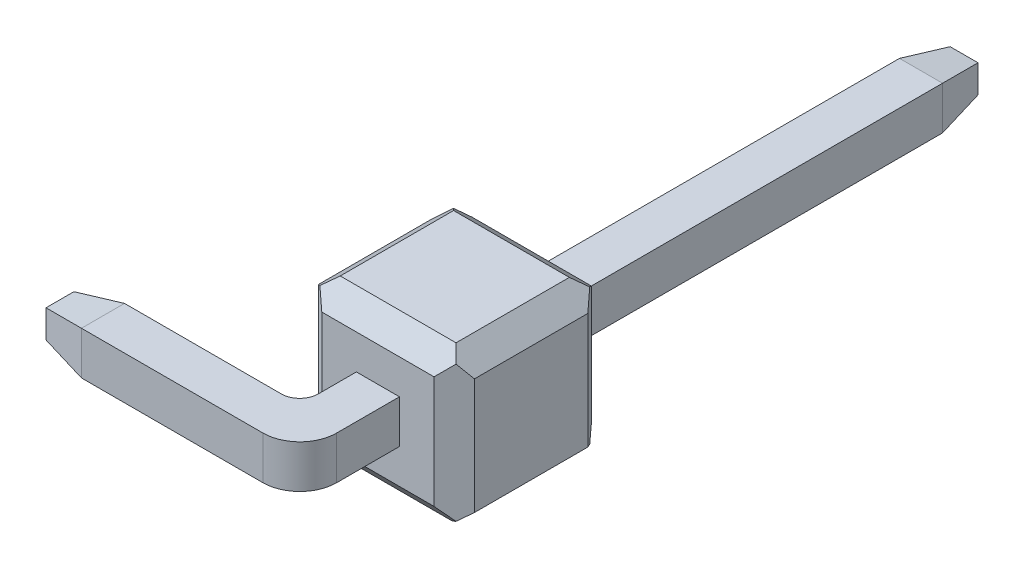
ISO-10303-21;
HEADER;
FILE_DESCRIPTION(('STEP AP214'),'2;1');
FILE_NAME('part.step','',(''),(''),'','','');
FILE_SCHEMA(('AUTOMOTIVE_DESIGN { 1 0 10303 214 1 1 1 1 }'));
ENDSEC;
DATA;
#1=APPLICATION_CONTEXT('core data for automotive mechanical design processes');
#2=APPLICATION_PROTOCOL_DEFINITION('international standard','automotive_design',2000,#1);
#3=PRODUCT_CONTEXT('',#1,'mechanical');
#4=PRODUCT('Part','Part','',(#3));
#5=PRODUCT_RELATED_PRODUCT_CATEGORY('part','',(#4));
#6=PRODUCT_DEFINITION_FORMATION('','',#4);
#7=PRODUCT_DEFINITION_CONTEXT('part definition',#1,'design');
#8=PRODUCT_DEFINITION('design','',#6,#7);
#9=PRODUCT_DEFINITION_SHAPE('','',#8);
#10=(LENGTH_UNIT() NAMED_UNIT(*) SI_UNIT(.MILLI.,.METRE.));
#11=(NAMED_UNIT(*) PLANE_ANGLE_UNIT() SI_UNIT($,.RADIAN.));
#12=(NAMED_UNIT(*) SI_UNIT($,.STERADIAN.) SOLID_ANGLE_UNIT());
#13=UNCERTAINTY_MEASURE_WITH_UNIT(LENGTH_MEASURE(1.E-05),#10,'distance_accuracy_value','');
#14=(GEOMETRIC_REPRESENTATION_CONTEXT(3) GLOBAL_UNCERTAINTY_ASSIGNED_CONTEXT((#13)) GLOBAL_UNIT_ASSIGNED_CONTEXT((#10,
#11,#12)) REPRESENTATION_CONTEXT('',''));
#15=CARTESIAN_POINT('',(0.,0.,0.));
#16=DIRECTION('',(0.,0.,1.));
#17=DIRECTION('',(1.,0.,0.));
#18=AXIS2_PLACEMENT_3D('',#15,#16,#17);
#19=CARTESIAN_POINT('',(-0.35,0.7,0.));
#20=DIRECTION('',(1.,0.,0.));
#21=DIRECTION('',(0.,0.,-1.));
#22=AXIS2_PLACEMENT_3D('',#19,#20,#21);
#23=PLANE('',#22);
#24=DIRECTION('',(0.,-1.,0.));
#25=VECTOR('',#24,1.);
#26=CARTESIAN_POINT('',(-0.35,0.7,7.03));
#27=LINE('',#26,#25);
#28=CARTESIAN_POINT('',(-0.35,0.7,7.03));
#29=VERTEX_POINT('',#28);
#30=CARTESIAN_POINT('',(-0.35,0.,7.03));
#31=VERTEX_POINT('',#30);
#32=EDGE_CURVE('E635',#29,#31,#27,.T.);
#33=ORIENTED_EDGE('',*,*,#32,.F.);
#34=DIRECTION('',(0.,0.,1.));
#35=VECTOR('',#34,1.);
#36=CARTESIAN_POINT('',(-0.35,0.7,0.));
#37=LINE('',#36,#35);
#38=CARTESIAN_POINT('',(-0.35,0.7,0.700000000000013));
#39=VERTEX_POINT('',#38);
#40=EDGE_CURVE('E665',#39,#29,#37,.T.);
#41=ORIENTED_EDGE('',*,*,#40,.F.);
#42=DIRECTION('',(0.,-1.,0.));
#43=VECTOR('',#42,1.);
#44=CARTESIAN_POINT('',(-0.35,0.7,0.700000000000013));
#45=LINE('',#44,#43);
#46=CARTESIAN_POINT('',(-0.35,0.,0.700000000000013));
#47=VERTEX_POINT('',#46);
#48=EDGE_CURVE('E574',#39,#47,#45,.T.);
#49=ORIENTED_EDGE('',*,*,#48,.T.);
#50=DIRECTION('',(0.,0.,1.));
#51=VECTOR('',#50,1.);
#52=CARTESIAN_POINT('',(-0.35,0.,0.));
#53=LINE('',#52,#51);
#54=EDGE_CURVE('E253',#47,#31,#53,.T.);
#55=ORIENTED_EDGE('',*,*,#54,.T.);
#56=EDGE_LOOP('',(#33,#41,#49,#55));
#57=FACE_BOUND('',#56,.T.);
#58=ADVANCED_FACE('F33',(#57),#23,.F.);
#59=CARTESIAN_POINT('',(0.35,0.7,0.));
#60=DIRECTION('',(-1.,0.,0.));
#61=DIRECTION('',(0.,0.,1.));
#62=AXIS2_PLACEMENT_3D('',#59,#60,#61);
#63=PLANE('',#62);
#64=DIRECTION('',(0.,1.,0.));
#65=VECTOR('',#64,1.);
#66=CARTESIAN_POINT('',(0.35,0.7,7.03));
#67=LINE('',#66,#65);
#68=CARTESIAN_POINT('',(0.35,0.,7.03));
#69=VERTEX_POINT('',#68);
#70=CARTESIAN_POINT('',(0.35,0.7,7.03));
#71=VERTEX_POINT('',#70);
#72=EDGE_CURVE('E658',#69,#71,#67,.T.);
#73=ORIENTED_EDGE('',*,*,#72,.F.);
#74=DIRECTION('',(0.,0.,-1.));
#75=VECTOR('',#74,1.);
#76=CARTESIAN_POINT('',(0.35,0.,0.));
#77=LINE('',#76,#75);
#78=CARTESIAN_POINT('',(0.35,0.,0.700000000000013));
#79=VERTEX_POINT('',#78);
#80=EDGE_CURVE('E549',#69,#79,#77,.T.);
#81=ORIENTED_EDGE('',*,*,#80,.T.);
#82=DIRECTION('',(0.,1.,0.));
#83=VECTOR('',#82,1.);
#84=CARTESIAN_POINT('',(0.35,0.7,0.700000000000013));
#85=LINE('',#84,#83);
#86=CARTESIAN_POINT('',(0.35,0.7,0.700000000000013));
#87=VERTEX_POINT('',#86);
#88=EDGE_CURVE('E568',#79,#87,#85,.T.);
#89=ORIENTED_EDGE('',*,*,#88,.T.);
#90=DIRECTION('',(0.,0.,-1.));
#91=VECTOR('',#90,1.);
#92=CARTESIAN_POINT('',(0.35,0.7,0.));
#93=LINE('',#92,#91);
#94=EDGE_CURVE('E627',#71,#87,#93,.T.);
#95=ORIENTED_EDGE('',*,*,#94,.F.);
#96=EDGE_LOOP('',(#73,#81,#89,#95));
#97=FACE_BOUND('',#96,.T.);
#98=ADVANCED_FACE('F470',(#97),#63,.F.);
#99=CARTESIAN_POINT('',(-0.25,0.7,10.55));
#100=DIRECTION('',(0.,-1.,0.));
#101=DIRECTION('',(0.,0.,-1.));
#102=AXIS2_PLACEMENT_3D('',#99,#100,#101);
#103=PLANE('',#102);
#104=DIRECTION('',(-1.,0.,0.));
#105=VECTOR('',#104,1.);
#106=CARTESIAN_POINT('',(-0.25,0.7,7.03));
#107=LINE('',#106,#105);
#108=EDGE_CURVE('E604',#71,#29,#107,.T.);
#109=ORIENTED_EDGE('',*,*,#108,.F.);
#110=ORIENTED_EDGE('',*,*,#94,.T.);
#111=DIRECTION('',(-1.,0.,0.));
#112=VECTOR('',#111,1.);
#113=CARTESIAN_POINT('',(-0.25,0.7,0.700000000000013));
#114=LINE('',#113,#112);
#115=EDGE_CURVE('E576',#87,#39,#114,.T.);
#116=ORIENTED_EDGE('',*,*,#115,.T.);
#117=ORIENTED_EDGE('',*,*,#40,.T.);
#118=EDGE_LOOP('',(#109,#110,#116,#117));
#119=FACE_BOUND('',#118,.T.);
#120=ADVANCED_FACE('F476',(#119),#103,.F.);
#121=CARTESIAN_POINT('',(-0.25,0.,10.55));
#122=DIRECTION('',(0.,-1.,0.));
#123=DIRECTION('',(0.,0.,-1.));
#124=AXIS2_PLACEMENT_3D('',#121,#122,#123);
#125=PLANE('',#124);
#126=ORIENTED_EDGE('',*,*,#80,.F.);
#127=DIRECTION('',(-1.,0.,0.));
#128=VECTOR('',#127,1.);
#129=CARTESIAN_POINT('',(-0.25,0.,7.03));
#130=LINE('',#129,#128);
#131=EDGE_CURVE('E268',#69,#31,#130,.T.);
#132=ORIENTED_EDGE('',*,*,#131,.T.);
#133=ORIENTED_EDGE('',*,*,#54,.F.);
#134=DIRECTION('',(1.,0.,0.));
#135=VECTOR('',#134,1.);
#136=CARTESIAN_POINT('',(0.35,0.,0.700000000000013));
#137=LINE('',#136,#135);
#138=EDGE_CURVE('E571',#47,#79,#137,.T.);
#139=ORIENTED_EDGE('',*,*,#138,.T.);
#140=EDGE_LOOP('',(#126,#132,#133,#139));
#141=FACE_BOUND('',#140,.T.);
#142=ADVANCED_FACE('F495',(#141),#125,.T.);
#143=CARTESIAN_POINT('',(-0.35,0.7,0.));
#144=DIRECTION('',(0.,0.,1.));
#145=DIRECTION('',(1.,0.,0.));
#146=AXIS2_PLACEMENT_3D('',#143,#144,#145);
#147=PLANE('',#146);
#148=DIRECTION('',(1.,0.,0.));
#149=VECTOR('',#148,1.);
#150=CARTESIAN_POINT('',(-0.35,0.576571113504075,0.));
#151=LINE('',#150,#149);
#152=CARTESIAN_POINT('',(-0.226571113504075,0.576571113504075,0.));
#153=VERTEX_POINT('',#152);
#154=CARTESIAN_POINT('',(0.226571113504075,0.576571113504075,0.));
#155=VERTEX_POINT('',#154);
#156=EDGE_CURVE('E559',#153,#155,#151,.T.);
#157=ORIENTED_EDGE('',*,*,#156,.T.);
#158=DIRECTION('',(0.,-1.,0.));
#159=VECTOR('',#158,1.);
#160=CARTESIAN_POINT('',(0.226571113504075,0.7,0.));
#161=LINE('',#160,#159);
#162=CARTESIAN_POINT('',(0.226571113504075,0.123428886495925,0.));
#163=VERTEX_POINT('',#162);
#164=EDGE_CURVE('E565',#155,#163,#161,.T.);
#165=ORIENTED_EDGE('',*,*,#164,.T.);
#166=DIRECTION('',(-1.,0.,0.));
#167=VECTOR('',#166,1.);
#168=CARTESIAN_POINT('',(-0.35,0.123428886495925,0.));
#169=LINE('',#168,#167);
#170=CARTESIAN_POINT('',(-0.226571113504075,0.123428886495925,0.));
#171=VERTEX_POINT('',#170);
#172=EDGE_CURVE('E563',#163,#171,#169,.T.);
#173=ORIENTED_EDGE('',*,*,#172,.T.);
#174=DIRECTION('',(0.,1.,0.));
#175=VECTOR('',#174,1.);
#176=CARTESIAN_POINT('',(-0.226571113504075,0.7,0.));
#177=LINE('',#176,#175);
#178=EDGE_CURVE('E561',#171,#153,#177,.T.);
#179=ORIENTED_EDGE('',*,*,#178,.T.);
#180=EDGE_LOOP('',(#157,#165,#173,#179));
#181=FACE_BOUND('',#180,.T.);
#182=ADVANCED_FACE('F677',(#181),#147,.F.);
#183=CARTESIAN_POINT('',(-0.35,0.7,0.700000000000013));
#184=DIRECTION('',(0.984807753012208,0.,0.173648177666927));
#185=DIRECTION('',(0.,-1.,0.));
#186=AXIS2_PLACEMENT_3D('',#183,#184,#185);
#187=PLANE('',#186);
#188=DIRECTION('',(0.171087869746032,0.171087869746032,-0.970287525247815));
#189=VECTOR('',#188,1.);
#190=CARTESIAN_POINT('',(-0.329510258578035,0.0204897414219648,0.583796901984954));
#191=LINE('',#190,#189);
#192=EDGE_CURVE('E584',#47,#171,#191,.T.);
#193=ORIENTED_EDGE('',*,*,#192,.F.);
#194=ORIENTED_EDGE('',*,*,#48,.F.);
#195=DIRECTION('',(-0.171087869746032,0.171087869746032,0.970287525247815));
#196=VECTOR('',#195,1.);
#197=CARTESIAN_POINT('',(-0.347072894082576,0.697072894082576,0.683399557426433));
#198=LINE('',#197,#196);
#199=EDGE_CURVE('E254',#153,#39,#198,.T.);
#200=ORIENTED_EDGE('',*,*,#199,.F.);
#201=ORIENTED_EDGE('',*,*,#178,.F.);
#202=EDGE_LOOP('',(#193,#194,#200,#201));
#203=FACE_BOUND('',#202,.T.);
#204=ADVANCED_FACE('F645',(#203),#187,.F.);
#205=CARTESIAN_POINT('',(-0.25,0.7,0.700000000000013));
#206=DIRECTION('',(0.,-0.984807753012208,0.173648177666927));
#207=DIRECTION('',(-1.,0.,0.));
#208=AXIS2_PLACEMENT_3D('',#205,#206,#207);
#209=PLANE('',#208);
#210=ORIENTED_EDGE('',*,*,#199,.T.);
#211=ORIENTED_EDGE('',*,*,#115,.F.);
#212=DIRECTION('',(-0.171087869746032,-0.171087869746032,-0.970287525247815));
#213=VECTOR('',#212,1.);
#214=CARTESIAN_POINT('',(0.332437364495459,0.682437364495459,0.600397344558534));
#215=LINE('',#214,#213);
#216=EDGE_CURVE('E581',#155,#87,#215,.F.);
#217=ORIENTED_EDGE('',*,*,#216,.F.);
#218=ORIENTED_EDGE('',*,*,#156,.F.);
#219=EDGE_LOOP('',(#210,#211,#217,#218));
#220=FACE_BOUND('',#219,.T.);
#221=ADVANCED_FACE('F688',(#220),#209,.F.);
#222=CARTESIAN_POINT('',(-0.35,0.123428886495925,0.));
#223=DIRECTION('',(0.,-0.984807753012208,-0.173648177666927));
#224=DIRECTION('',(1.,0.,0.));
#225=AXIS2_PLACEMENT_3D('',#222,#223,#224);
#226=PLANE('',#225);
#227=ORIENTED_EDGE('',*,*,#192,.T.);
#228=ORIENTED_EDGE('',*,*,#172,.F.);
#229=DIRECTION('',(-0.171087869746032,0.171087869746032,-0.970287525247815));
#230=VECTOR('',#229,1.);
#231=CARTESIAN_POINT('',(0.209694266322542,0.140305733677458,-0.0957133565930937));
#232=LINE('',#231,#230);
#233=EDGE_CURVE('E579',#79,#163,#232,.T.);
#234=ORIENTED_EDGE('',*,*,#233,.F.);
#235=ORIENTED_EDGE('',*,*,#138,.F.);
#236=EDGE_LOOP('',(#227,#228,#234,#235));
#237=FACE_BOUND('',#236,.T.);
#238=ADVANCED_FACE('F650',(#237),#226,.T.);
#239=CARTESIAN_POINT('',(0.226571113504075,0.7,0.));
#240=DIRECTION('',(-0.984807753012208,0.,0.173648177666927));
#241=DIRECTION('',(0.,-1.,0.));
#242=AXIS2_PLACEMENT_3D('',#239,#240,#241);
#243=PLANE('',#242);
#244=ORIENTED_EDGE('',*,*,#216,.T.);
#245=ORIENTED_EDGE('',*,*,#88,.F.);
#246=ORIENTED_EDGE('',*,*,#233,.T.);
#247=ORIENTED_EDGE('',*,*,#164,.F.);
#248=EDGE_LOOP('',(#244,#245,#246,#247));
#249=FACE_BOUND('',#248,.T.);
#250=ADVANCED_FACE('F653',(#249),#243,.F.);
#251=CARTESIAN_POINT('',(0.,0.,7.03));
#252=DIRECTION('',(0.,0.,1.));
#253=DIRECTION('',(1.,0.,0.));
#254=AXIS2_PLACEMENT_3D('',#251,#252,#253);
#255=PLANE('',#254);
#256=DIRECTION('',(0.,-1.,0.));
#257=VECTOR('',#256,1.);
#258=CARTESIAN_POINT('',(0.969999999999998,-0.92,7.03));
#259=LINE('',#258,#257);
#260=CARTESIAN_POINT('',(0.969999999999998,1.32,7.03));
#261=VERTEX_POINT('',#260);
#262=CARTESIAN_POINT('',(0.969999999999998,-0.619999999999998,7.03));
#263=VERTEX_POINT('',#262);
#264=EDGE_CURVE('E281',#261,#263,#259,.T.);
#265=ORIENTED_EDGE('',*,*,#264,.T.);
#266=DIRECTION('',(-1.,0.,0.));
#267=VECTOR('',#266,1.);
#268=CARTESIAN_POINT('',(-1.27,-0.619999999999999,7.03));
#269=LINE('',#268,#267);
#270=CARTESIAN_POINT('',(-0.969999999999998,-0.619999999999999,7.03));
#271=VERTEX_POINT('',#270);
#272=EDGE_CURVE('E288',#263,#271,#269,.T.);
#273=ORIENTED_EDGE('',*,*,#272,.T.);
#274=DIRECTION('',(0.,1.,0.));
#275=VECTOR('',#274,1.);
#276=CARTESIAN_POINT('',(-0.969999999999999,1.62,7.03));
#277=LINE('',#276,#275);
#278=CARTESIAN_POINT('',(-0.969999999999999,1.32,7.03));
#279=VERTEX_POINT('',#278);
#280=EDGE_CURVE('E285',#271,#279,#277,.T.);
#281=ORIENTED_EDGE('',*,*,#280,.T.);
#282=DIRECTION('',(1.,0.,0.));
#283=VECTOR('',#282,1.);
#284=CARTESIAN_POINT('',(1.27,1.32,7.03));
#285=LINE('',#284,#283);
#286=EDGE_CURVE('E283',#279,#261,#285,.T.);
#287=ORIENTED_EDGE('',*,*,#286,.T.);
#288=EDGE_LOOP('',(#265,#273,#281,#287));
#289=FACE_BOUND('',#288,.T.);
#290=ORIENTED_EDGE('',*,*,#72,.T.);
#291=ORIENTED_EDGE('',*,*,#108,.T.);
#292=ORIENTED_EDGE('',*,*,#32,.T.);
#293=ORIENTED_EDGE('',*,*,#131,.F.);
#294=EDGE_LOOP('',(#290,#291,#292,#293));
#295=FACE_BOUND('',#294,.T.);
#296=ADVANCED_FACE('F411',(#289,#295),#255,.F.);
#297=CARTESIAN_POINT('',(0.,0.,9.53));
#298=DIRECTION('',(0.,0.,1.));
#299=DIRECTION('',(1.,0.,0.));
#300=AXIS2_PLACEMENT_3D('',#297,#298,#299);
#301=PLANE('',#300);
#302=DIRECTION('',(0.,-1.,0.));
#303=VECTOR('',#302,1.);
#304=CARTESIAN_POINT('',(-0.912473922221739,0.,9.53));
#305=LINE('',#304,#303);
#306=CARTESIAN_POINT('',(-0.912473922221739,1.26247392222174,9.53));
#307=VERTEX_POINT('',#306);
#308=CARTESIAN_POINT('',(-0.912473922221738,-0.562473922221739,9.53));
#309=VERTEX_POINT('',#308);
#310=EDGE_CURVE('E315',#307,#309,#305,.T.);
#311=ORIENTED_EDGE('',*,*,#310,.T.);
#312=DIRECTION('',(1.,0.,0.));
#313=VECTOR('',#312,1.);
#314=CARTESIAN_POINT('',(0.,-0.562473922221739,9.53));
#315=LINE('',#314,#313);
#316=CARTESIAN_POINT('',(0.912473922221738,-0.562473922221738,9.53));
#317=VERTEX_POINT('',#316);
#318=EDGE_CURVE('E317',#309,#317,#315,.T.);
#319=ORIENTED_EDGE('',*,*,#318,.T.);
#320=DIRECTION('',(0.,1.,0.));
#321=VECTOR('',#320,1.);
#322=CARTESIAN_POINT('',(0.912473922221738,0.,9.53));
#323=LINE('',#322,#321);
#324=CARTESIAN_POINT('',(0.912473922221738,1.26247392222174,9.53));
#325=VERTEX_POINT('',#324);
#326=EDGE_CURVE('E300',#317,#325,#323,.T.);
#327=ORIENTED_EDGE('',*,*,#326,.T.);
#328=DIRECTION('',(-1.,0.,0.));
#329=VECTOR('',#328,1.);
#330=CARTESIAN_POINT('',(0.,1.26247392222174,9.53));
#331=LINE('',#330,#329);
#332=EDGE_CURVE('E313',#325,#307,#331,.T.);
#333=ORIENTED_EDGE('',*,*,#332,.T.);
#334=EDGE_LOOP('',(#311,#319,#327,#333));
#335=FACE_BOUND('',#334,.T.);
#336=DIRECTION('',(-1.,0.,0.));
#337=VECTOR('',#336,1.);
#338=CARTESIAN_POINT('',(-0.25,0.7,9.53));
#339=LINE('',#338,#337);
#340=CARTESIAN_POINT('',(0.35,0.7,9.53));
#341=VERTEX_POINT('',#340);
#342=CARTESIAN_POINT('',(-0.35,0.7,9.53));
#343=VERTEX_POINT('',#342);
#344=EDGE_CURVE('E263',#341,#343,#339,.T.);
#345=ORIENTED_EDGE('',*,*,#344,.F.);
#346=DIRECTION('',(0.,1.,0.));
#347=VECTOR('',#346,1.);
#348=CARTESIAN_POINT('',(0.35,0.7,9.53));
#349=LINE('',#348,#347);
#350=CARTESIAN_POINT('',(0.35,0.,9.53));
#351=VERTEX_POINT('',#350);
#352=EDGE_CURVE('E264',#351,#341,#349,.T.);
#353=ORIENTED_EDGE('',*,*,#352,.F.);
#354=DIRECTION('',(-1.,0.,0.));
#355=VECTOR('',#354,1.);
#356=CARTESIAN_POINT('',(-0.25,0.,9.53));
#357=LINE('',#356,#355);
#358=CARTESIAN_POINT('',(-0.35,0.,9.53));
#359=VERTEX_POINT('',#358);
#360=EDGE_CURVE('E246',#351,#359,#357,.T.);
#361=ORIENTED_EDGE('',*,*,#360,.T.);
#362=DIRECTION('',(0.,-1.,0.));
#363=VECTOR('',#362,1.);
#364=CARTESIAN_POINT('',(-0.35,0.7,9.53));
#365=LINE('',#364,#363);
#366=EDGE_CURVE('E258',#343,#359,#365,.T.);
#367=ORIENTED_EDGE('',*,*,#366,.F.);
#368=EDGE_LOOP('',(#345,#353,#361,#367));
#369=FACE_BOUND('',#368,.T.);
#370=ADVANCED_FACE('F267',(#335,#369),#301,.T.);
#371=CARTESIAN_POINT('',(-1.27,-0.92,7.03));
#372=DIRECTION('',(-1.,0.,0.));
#373=DIRECTION('',(0.,-1.,0.));
#374=AXIS2_PLACEMENT_3D('',#371,#372,#373);
#375=PLANE('',#374);
#376=DIRECTION('',(0.,1.,0.));
#377=VECTOR('',#376,1.);
#378=CARTESIAN_POINT('',(-1.27,-0.92,9.23));
#379=LINE('',#378,#377);
#380=CARTESIAN_POINT('',(-1.27,-0.562473922221737,9.23));
#381=VERTEX_POINT('',#380);
#382=CARTESIAN_POINT('',(-1.27,1.32,9.23));
#383=VERTEX_POINT('',#382);
#384=EDGE_CURVE('E322',#381,#383,#379,.T.);
#385=ORIENTED_EDGE('',*,*,#384,.T.);
#386=DIRECTION('',(0.,0.,-1.));
#387=VECTOR('',#386,1.);
#388=CARTESIAN_POINT('',(-1.27,1.32,7.03));
#389=LINE('',#388,#387);
#390=CARTESIAN_POINT('',(-1.27,1.32,7.38752607777826));
#391=VERTEX_POINT('',#390);
#392=EDGE_CURVE('E373',#383,#391,#389,.T.);
#393=ORIENTED_EDGE('',*,*,#392,.T.);
#394=DIRECTION('',(0.,-1.,0.));
#395=VECTOR('',#394,1.);
#396=CARTESIAN_POINT('',(-1.27,-0.92,7.38752607777826));
#397=LINE('',#396,#395);
#398=CARTESIAN_POINT('',(-1.27,-0.562473922221737,7.38752607777826));
#399=VERTEX_POINT('',#398);
#400=EDGE_CURVE('E291',#391,#399,#397,.T.);
#401=ORIENTED_EDGE('',*,*,#400,.T.);
#402=DIRECTION('',(0.,0.,1.));
#403=VECTOR('',#402,1.);
#404=CARTESIAN_POINT('',(-1.27,-0.562473922221737,7.03));
#405=LINE('',#404,#403);
#406=EDGE_CURVE('E370',#399,#381,#405,.T.);
#407=ORIENTED_EDGE('',*,*,#406,.T.);
#408=EDGE_LOOP('',(#385,#393,#401,#407));
#409=FACE_BOUND('',#408,.T.);
#410=ADVANCED_FACE('F439',(#409),#375,.T.);
#411=CARTESIAN_POINT('',(1.27,1.62,7.03));
#412=DIRECTION('',(0.,1.,0.));
#413=DIRECTION('',(-1.,0.,0.));
#414=AXIS2_PLACEMENT_3D('',#411,#412,#413);
#415=PLANE('',#414);
#416=DIRECTION('',(1.,0.,0.));
#417=VECTOR('',#416,1.);
#418=CARTESIAN_POINT('',(1.27,1.62,9.23));
#419=LINE('',#418,#417);
#420=CARTESIAN_POINT('',(-0.91247392222174,1.62,9.23));
#421=VERTEX_POINT('',#420);
#422=CARTESIAN_POINT('',(0.97,1.62,9.23));
#423=VERTEX_POINT('',#422);
#424=EDGE_CURVE('E325',#421,#423,#419,.T.);
#425=ORIENTED_EDGE('',*,*,#424,.T.);
#426=DIRECTION('',(0.,0.,-1.));
#427=VECTOR('',#426,1.);
#428=CARTESIAN_POINT('',(0.97,1.62,7.03));
#429=LINE('',#428,#427);
#430=CARTESIAN_POINT('',(0.97,1.62,7.38752607777826));
#431=VERTEX_POINT('',#430);
#432=EDGE_CURVE('E356',#423,#431,#429,.T.);
#433=ORIENTED_EDGE('',*,*,#432,.T.);
#434=DIRECTION('',(-1.,0.,0.));
#435=VECTOR('',#434,1.);
#436=CARTESIAN_POINT('',(-1.27,1.62,7.38752607777826));
#437=LINE('',#436,#435);
#438=CARTESIAN_POINT('',(-0.912473922221737,1.62,7.38752607777826));
#439=VERTEX_POINT('',#438);
#440=EDGE_CURVE('E294',#431,#439,#437,.T.);
#441=ORIENTED_EDGE('',*,*,#440,.T.);
#442=DIRECTION('',(0.,0.,1.));
#443=VECTOR('',#442,1.);
#444=CARTESIAN_POINT('',(-0.912473922221739,1.62,7.03));
#445=LINE('',#444,#443);
#446=EDGE_CURVE('E353',#439,#421,#445,.T.);
#447=ORIENTED_EDGE('',*,*,#446,.T.);
#448=EDGE_LOOP('',(#425,#433,#441,#447));
#449=FACE_BOUND('',#448,.T.);
#450=ADVANCED_FACE('F459',(#449),#415,.T.);
#451=CARTESIAN_POINT('',(1.27,-0.92,7.03));
#452=DIRECTION('',(1.,0.,0.));
#453=DIRECTION('',(0.,0.,-1.));
#454=AXIS2_PLACEMENT_3D('',#451,#452,#453);
#455=PLANE('',#454);
#456=DIRECTION('',(0.,1.,0.));
#457=VECTOR('',#456,1.);
#458=CARTESIAN_POINT('',(1.27,1.62,7.38752607777826));
#459=LINE('',#458,#457);
#460=CARTESIAN_POINT('',(1.27,-0.619999999999998,7.38752607777826));
#461=VERTEX_POINT('',#460);
#462=CARTESIAN_POINT('',(1.27,1.26247392222174,7.38752607777826));
#463=VERTEX_POINT('',#462);
#464=EDGE_CURVE('E297',#461,#463,#459,.T.);
#465=ORIENTED_EDGE('',*,*,#464,.T.);
#466=DIRECTION('',(0.,0.,1.));
#467=VECTOR('',#466,1.);
#468=CARTESIAN_POINT('',(1.27,1.26247392222174,7.03));
#469=LINE('',#468,#467);
#470=CARTESIAN_POINT('',(1.27,1.26247392222174,9.23));
#471=VERTEX_POINT('',#470);
#472=EDGE_CURVE('E342',#463,#471,#469,.T.);
#473=ORIENTED_EDGE('',*,*,#472,.T.);
#474=DIRECTION('',(0.,-1.,0.));
#475=VECTOR('',#474,1.);
#476=CARTESIAN_POINT('',(1.27,-0.92,9.23));
#477=LINE('',#476,#475);
#478=CARTESIAN_POINT('',(1.27,-0.619999999999998,9.23));
#479=VERTEX_POINT('',#478);
#480=EDGE_CURVE('E328',#471,#479,#477,.T.);
#481=ORIENTED_EDGE('',*,*,#480,.T.);
#482=DIRECTION('',(0.,0.,-1.));
#483=VECTOR('',#482,1.);
#484=CARTESIAN_POINT('',(1.27,-0.619999999999998,7.03));
#485=LINE('',#484,#483);
#486=EDGE_CURVE('E331',#479,#461,#485,.T.);
#487=ORIENTED_EDGE('',*,*,#486,.T.);
#488=EDGE_LOOP('',(#465,#473,#481,#487));
#489=FACE_BOUND('',#488,.T.);
#490=ADVANCED_FACE('F422',(#489),#455,.T.);
#491=CARTESIAN_POINT('',(1.27,-0.92,7.03));
#492=DIRECTION('',(0.,-1.,0.));
#493=DIRECTION('',(1.,0.,0.));
#494=AXIS2_PLACEMENT_3D('',#491,#492,#493);
#495=PLANE('',#494);
#496=DIRECTION('',(-1.,0.,0.));
#497=VECTOR('',#496,1.);
#498=CARTESIAN_POINT('',(1.27,-0.92,9.23));
#499=LINE('',#498,#497);
#500=CARTESIAN_POINT('',(0.912473922221737,-0.92,9.23));
#501=VERTEX_POINT('',#500);
#502=CARTESIAN_POINT('',(-0.969999999999998,-0.92,9.23));
#503=VERTEX_POINT('',#502);
#504=EDGE_CURVE('E320',#501,#503,#499,.T.);
#505=ORIENTED_EDGE('',*,*,#504,.T.);
#506=DIRECTION('',(0.,0.,-1.));
#507=VECTOR('',#506,1.);
#508=CARTESIAN_POINT('',(-0.969999999999998,-0.92,7.03));
#509=LINE('',#508,#507);
#510=CARTESIAN_POINT('',(-0.969999999999998,-0.92,7.38752607777826));
#511=VERTEX_POINT('',#510);
#512=EDGE_CURVE('E54',#503,#511,#509,.T.);
#513=ORIENTED_EDGE('',*,*,#512,.T.);
#514=DIRECTION('',(1.,0.,0.));
#515=VECTOR('',#514,1.);
#516=CARTESIAN_POINT('',(1.27,-0.92,7.38752607777826));
#517=LINE('',#516,#515);
#518=CARTESIAN_POINT('',(0.912473922221737,-0.92,7.38752607777826));
#519=VERTEX_POINT('',#518);
#520=EDGE_CURVE('E272',#511,#519,#517,.T.);
#521=ORIENTED_EDGE('',*,*,#520,.T.);
#522=DIRECTION('',(0.,0.,1.));
#523=VECTOR('',#522,1.);
#524=CARTESIAN_POINT('',(0.912473922221737,-0.92,7.03));
#525=LINE('',#524,#523);
#526=EDGE_CURVE('E383',#519,#501,#525,.T.);
#527=ORIENTED_EDGE('',*,*,#526,.T.);
#528=EDGE_LOOP('',(#505,#513,#521,#527));
#529=FACE_BOUND('',#528,.T.);
#530=ADVANCED_FACE('F388',(#529),#495,.T.);
#531=CARTESIAN_POINT('',(-3.9,0.7,10.5734288864959));
#532=DIRECTION('',(0.173648177666927,0.,0.984807753012208));
#533=DIRECTION('',(0.,-1.,0.));
#534=AXIS2_PLACEMENT_3D('',#531,#532,#533);
#535=PLANE('',#534);
#536=DIRECTION('',(-0.970287525247815,-0.171087869746032,0.171087869746032));
#537=VECTOR('',#536,1.);
#538=CARTESIAN_POINT('',(-3.21660044257357,0.697072894082576,10.4529271059174));
#539=LINE('',#538,#537);
#540=CARTESIAN_POINT('',(-3.9,0.576571113504075,10.5734288864959));
#541=VERTEX_POINT('',#540);
#542=CARTESIAN_POINT('',(-3.19999999999999,0.7,10.45));
#543=VERTEX_POINT('',#542);
#544=EDGE_CURVE('E603',#541,#543,#539,.F.);
#545=ORIENTED_EDGE('',*,*,#544,.T.);
#546=DIRECTION('',(0.,1.,0.));
#547=VECTOR('',#546,1.);
#548=CARTESIAN_POINT('',(-3.19999999999999,0.7,10.45));
#549=LINE('',#548,#547);
#550=CARTESIAN_POINT('',(-3.19999999999999,0.,10.45));
#551=VERTEX_POINT('',#550);
#552=EDGE_CURVE('E597',#551,#543,#549,.T.);
#553=ORIENTED_EDGE('',*,*,#552,.F.);
#554=DIRECTION('',(-0.970287525247815,0.171087869746032,0.171087869746032));
#555=VECTOR('',#554,1.);
#556=CARTESIAN_POINT('',(-3.87951025857803,0.119815992255493,10.5698159922555));
#557=LINE('',#556,#555);
#558=CARTESIAN_POINT('',(-3.9,0.123428886495925,10.5734288864959));
#559=VERTEX_POINT('',#558);
#560=EDGE_CURVE('E601',#551,#559,#557,.T.);
#561=ORIENTED_EDGE('',*,*,#560,.T.);
#562=DIRECTION('',(0.,-1.,0.));
#563=VECTOR('',#562,1.);
#564=CARTESIAN_POINT('',(-3.9,0.7,10.5734288864959));
#565=LINE('',#564,#563);
#566=EDGE_CURVE('E594',#541,#559,#565,.T.);
#567=ORIENTED_EDGE('',*,*,#566,.F.);
#568=EDGE_LOOP('',(#545,#553,#561,#567));
#569=FACE_BOUND('',#568,.T.);
#570=ADVANCED_FACE('F511',(#569),#535,.F.);
#571=CARTESIAN_POINT('',(-3.9,0.7,10.45));
#572=DIRECTION('',(1.,0.,0.));
#573=DIRECTION('',(0.,0.,-1.));
#574=AXIS2_PLACEMENT_3D('',#571,#572,#573);
#575=PLANE('',#574);
#576=DIRECTION('',(0.,0.,-1.));
#577=VECTOR('',#576,1.);
#578=CARTESIAN_POINT('',(-3.9,0.576571113504075,10.45));
#579=LINE('',#578,#577);
#580=CARTESIAN_POINT('',(-3.9,0.576571113504075,11.0265711135041));
#581=VERTEX_POINT('',#580);
#582=EDGE_CURVE('E578',#581,#541,#579,.T.);
#583=ORIENTED_EDGE('',*,*,#582,.T.);
#584=ORIENTED_EDGE('',*,*,#566,.T.);
#585=DIRECTION('',(0.,0.,1.));
#586=VECTOR('',#585,1.);
#587=CARTESIAN_POINT('',(-3.9,0.123428886495925,11.15));
#588=LINE('',#587,#586);
#589=CARTESIAN_POINT('',(-3.9,0.123428886495925,11.0265711135041));
#590=VERTEX_POINT('',#589);
#591=EDGE_CURVE('E592',#559,#590,#588,.T.);
#592=ORIENTED_EDGE('',*,*,#591,.T.);
#593=DIRECTION('',(0.,1.,0.));
#594=VECTOR('',#593,1.);
#595=CARTESIAN_POINT('',(-3.9,0.7,11.0265711135041));
#596=LINE('',#595,#594);
#597=EDGE_CURVE('E590',#590,#581,#596,.T.);
#598=ORIENTED_EDGE('',*,*,#597,.T.);
#599=EDGE_LOOP('',(#583,#584,#592,#598));
#600=FACE_BOUND('',#599,.T.);
#601=ADVANCED_FACE('F507',(#600),#575,.F.);
#602=CARTESIAN_POINT('',(-3.19999999999999,0.7,11.15));
#603=DIRECTION('',(0.173648177666927,0.,-0.984807753012208));
#604=DIRECTION('',(0.,-1.,0.));
#605=AXIS2_PLACEMENT_3D('',#602,#603,#604);
#606=PLANE('',#605);
#607=DIRECTION('',(-0.970287525247815,0.171087869746032,-0.171087869746032));
#608=VECTOR('',#607,1.);
#609=CARTESIAN_POINT('',(-3.31620309801505,0.0204897414219648,11.129510258578));
#610=LINE('',#609,#608);
#611=CARTESIAN_POINT('',(-3.19999999999999,0.,11.15));
#612=VERTEX_POINT('',#611);
#613=EDGE_CURVE('E605',#612,#590,#610,.T.);
#614=ORIENTED_EDGE('',*,*,#613,.F.);
#615=DIRECTION('',(0.,-1.,0.));
#616=VECTOR('',#615,1.);
#617=CARTESIAN_POINT('',(-3.19999999999999,0.7,11.15));
#618=LINE('',#617,#616);
#619=CARTESIAN_POINT('',(-3.19999999999999,0.7,11.15));
#620=VERTEX_POINT('',#619);
#621=EDGE_CURVE('E274',#620,#612,#618,.T.);
#622=ORIENTED_EDGE('',*,*,#621,.F.);
#623=DIRECTION('',(0.970287525247815,0.171087869746032,0.171087869746032));
#624=VECTOR('',#623,1.);
#625=CARTESIAN_POINT('',(-3.29960265544147,0.682437364495459,11.1324373644955));
#626=LINE('',#625,#624);
#627=EDGE_CURVE('E277',#581,#620,#626,.T.);
#628=ORIENTED_EDGE('',*,*,#627,.F.);
#629=ORIENTED_EDGE('',*,*,#597,.F.);
#630=EDGE_LOOP('',(#614,#622,#628,#629));
#631=FACE_BOUND('',#630,.T.);
#632=ADVANCED_FACE('F510',(#631),#606,.F.);
#633=CARTESIAN_POINT('',(-3.19999999999999,0.7,10.55));
#634=DIRECTION('',(0.173648177666927,-0.984807753012208,0.));
#635=DIRECTION('',(0.,0.,1.));
#636=AXIS2_PLACEMENT_3D('',#633,#634,#635);
#637=PLANE('',#636);
#638=ORIENTED_EDGE('',*,*,#627,.T.);
#639=DIRECTION('',(0.,0.,1.));
#640=VECTOR('',#639,1.);
#641=CARTESIAN_POINT('',(-3.19999999999999,0.7,10.55));
#642=LINE('',#641,#640);
#643=EDGE_CURVE('E269',#543,#620,#642,.T.);
#644=ORIENTED_EDGE('',*,*,#643,.F.);
#645=ORIENTED_EDGE('',*,*,#544,.F.);
#646=ORIENTED_EDGE('',*,*,#582,.F.);
#647=EDGE_LOOP('',(#638,#644,#645,#646));
#648=FACE_BOUND('',#647,.T.);
#649=ADVANCED_FACE('F518',(#648),#637,.F.);
#650=CARTESIAN_POINT('',(-0.65,0.7,10.15));
#651=DIRECTION('',(0.,-1.,0.));
#652=DIRECTION('',(0.,0.,-1.));
#653=AXIS2_PLACEMENT_3D('',#650,#651,#652);
#654=CYLINDRICAL_SURFACE('',#653,0.3);
#655=CARTESIAN_POINT('',(-0.65,0.,10.15));
#656=DIRECTION('',(0.,-1.,0.));
#657=DIRECTION('',(0.,0.,-1.));
#658=AXIS2_PLACEMENT_3D('',#655,#656,#657);
#659=CIRCLE('',#658,0.3);
#660=CARTESIAN_POINT('',(-0.35,0.,10.15));
#661=VERTEX_POINT('',#660);
#662=CARTESIAN_POINT('',(-0.650000000000002,0.,10.45));
#663=VERTEX_POINT('',#662);
#664=EDGE_CURVE('E249',#661,#663,#659,.T.);
#665=ORIENTED_EDGE('',*,*,#664,.T.);
#666=DIRECTION('',(0.,-1.,0.));
#667=VECTOR('',#666,1.);
#668=CARTESIAN_POINT('',(-0.650000000000002,0.7,10.45));
#669=LINE('',#668,#667);
#670=CARTESIAN_POINT('',(-0.650000000000002,0.7,10.45));
#671=VERTEX_POINT('',#670);
#672=EDGE_CURVE('E528',#671,#663,#669,.T.);
#673=ORIENTED_EDGE('',*,*,#672,.F.);
#674=CARTESIAN_POINT('',(-0.65,0.7,10.15));
#675=DIRECTION('',(0.,-1.,0.));
#676=DIRECTION('',(0.,0.,-1.));
#677=AXIS2_PLACEMENT_3D('',#674,#675,#676);
#678=CIRCLE('',#677,0.3);
#679=CARTESIAN_POINT('',(-0.35,0.7,10.15));
#680=VERTEX_POINT('',#679);
#681=EDGE_CURVE('E667',#680,#671,#678,.T.);
#682=ORIENTED_EDGE('',*,*,#681,.F.);
#683=DIRECTION('',(0.,-1.,0.));
#684=VECTOR('',#683,1.);
#685=CARTESIAN_POINT('',(-0.35,0.7,10.15));
#686=LINE('',#685,#684);
#687=EDGE_CURVE('E530',#680,#661,#686,.T.);
#688=ORIENTED_EDGE('',*,*,#687,.T.);
#689=EDGE_LOOP('',(#665,#673,#682,#688));
#690=FACE_BOUND('',#689,.T.);
#691=ADVANCED_FACE('F515',(#690),#654,.F.);
#692=CARTESIAN_POINT('',(-0.650000000000002,0.7,10.45));
#693=DIRECTION('',(0.,0.,1.));
#694=DIRECTION('',(1.,0.,0.));
#695=AXIS2_PLACEMENT_3D('',#692,#693,#694);
#696=PLANE('',#695);
#697=DIRECTION('',(-1.,0.,0.));
#698=VECTOR('',#697,1.);
#699=CARTESIAN_POINT('',(-0.650000000000002,0.,10.45));
#700=LINE('',#699,#698);
#701=EDGE_CURVE('E531',#663,#551,#700,.T.);
#702=ORIENTED_EDGE('',*,*,#701,.T.);
#703=ORIENTED_EDGE('',*,*,#552,.T.);
#704=DIRECTION('',(-1.,0.,0.));
#705=VECTOR('',#704,1.);
#706=CARTESIAN_POINT('',(-0.650000000000002,0.7,10.45));
#707=LINE('',#706,#705);
#708=EDGE_CURVE('E537',#671,#543,#707,.T.);
#709=ORIENTED_EDGE('',*,*,#708,.F.);
#710=ORIENTED_EDGE('',*,*,#672,.T.);
#711=EDGE_LOOP('',(#702,#703,#709,#710));
#712=FACE_BOUND('',#711,.T.);
#713=ADVANCED_FACE('F513',(#712),#696,.F.);
#714=CARTESIAN_POINT('',(-3.9,0.123428886495925,10.45));
#715=DIRECTION('',(-0.173648177666927,-0.984807753012208,0.));
#716=DIRECTION('',(0.,0.,-1.));
#717=AXIS2_PLACEMENT_3D('',#714,#715,#716);
#718=PLANE('',#717);
#719=ORIENTED_EDGE('',*,*,#613,.T.);
#720=ORIENTED_EDGE('',*,*,#591,.F.);
#721=ORIENTED_EDGE('',*,*,#560,.F.);
#722=DIRECTION('',(0.,0.,-1.));
#723=VECTOR('',#722,1.);
#724=CARTESIAN_POINT('',(-3.19999999999999,0.,10.45));
#725=LINE('',#724,#723);
#726=EDGE_CURVE('E542',#612,#551,#725,.T.);
#727=ORIENTED_EDGE('',*,*,#726,.F.);
#728=EDGE_LOOP('',(#719,#720,#721,#727));
#729=FACE_BOUND('',#728,.T.);
#730=ADVANCED_FACE('F505',(#729),#718,.T.);
#731=CARTESIAN_POINT('',(-0.250000000000004,0.7,11.15));
#732=DIRECTION('',(0.,0.,-1.));
#733=DIRECTION('',(-1.,0.,0.));
#734=AXIS2_PLACEMENT_3D('',#731,#732,#733);
#735=PLANE('',#734);
#736=DIRECTION('',(1.,0.,0.));
#737=VECTOR('',#736,1.);
#738=CARTESIAN_POINT('',(-0.250000000000004,0.7,11.15));
#739=LINE('',#738,#737);
#740=CARTESIAN_POINT('',(-0.250000000000004,0.7,11.15));
#741=VERTEX_POINT('',#740);
#742=EDGE_CURVE('E620',#620,#741,#739,.T.);
#743=ORIENTED_EDGE('',*,*,#742,.F.);
#744=ORIENTED_EDGE('',*,*,#621,.T.);
#745=DIRECTION('',(1.,0.,0.));
#746=VECTOR('',#745,1.);
#747=CARTESIAN_POINT('',(-0.250000000000004,0.,11.15));
#748=LINE('',#747,#746);
#749=CARTESIAN_POINT('',(-0.250000000000004,0.,11.15));
#750=VERTEX_POINT('',#749);
#751=EDGE_CURVE('E543',#612,#750,#748,.T.);
#752=ORIENTED_EDGE('',*,*,#751,.T.);
#753=DIRECTION('',(0.,-1.,0.));
#754=VECTOR('',#753,1.);
#755=CARTESIAN_POINT('',(-0.250000000000004,0.7,11.15));
#756=LINE('',#755,#754);
#757=EDGE_CURVE('E538',#741,#750,#756,.T.);
#758=ORIENTED_EDGE('',*,*,#757,.F.);
#759=EDGE_LOOP('',(#743,#744,#752,#758));
#760=FACE_BOUND('',#759,.T.);
#761=ADVANCED_FACE('F501',(#760),#735,.F.);
#762=CARTESIAN_POINT('',(-0.25,0.7,10.55));
#763=DIRECTION('',(0.,-1.,0.));
#764=DIRECTION('',(0.,0.,-1.));
#765=AXIS2_PLACEMENT_3D('',#762,#763,#764);
#766=CYLINDRICAL_SURFACE('',#765,0.6);
#767=CARTESIAN_POINT('',(-0.25,0.,10.55));
#768=DIRECTION('',(0.,1.,0.));
#769=DIRECTION('',(0.,0.,-1.));
#770=AXIS2_PLACEMENT_3D('',#767,#768,#769);
#771=CIRCLE('',#770,0.6);
#772=CARTESIAN_POINT('',(0.35,0.,10.55));
#773=VERTEX_POINT('',#772);
#774=EDGE_CURVE('E545',#750,#773,#771,.T.);
#775=ORIENTED_EDGE('',*,*,#774,.T.);
#776=DIRECTION('',(0.,-1.,0.));
#777=VECTOR('',#776,1.);
#778=CARTESIAN_POINT('',(0.35,0.7,10.55));
#779=LINE('',#778,#777);
#780=CARTESIAN_POINT('',(0.35,0.7,10.55));
#781=VERTEX_POINT('',#780);
#782=EDGE_CURVE('E552',#781,#773,#779,.T.);
#783=ORIENTED_EDGE('',*,*,#782,.F.);
#784=CARTESIAN_POINT('',(-0.25,0.7,10.55));
#785=DIRECTION('',(0.,1.,0.));
#786=DIRECTION('',(0.,0.,-1.));
#787=AXIS2_PLACEMENT_3D('',#784,#785,#786);
#788=CIRCLE('',#787,0.6);
#789=EDGE_CURVE('E629',#741,#781,#788,.T.);
#790=ORIENTED_EDGE('',*,*,#789,.F.);
#791=ORIENTED_EDGE('',*,*,#757,.T.);
#792=EDGE_LOOP('',(#775,#783,#790,#791));
#793=FACE_BOUND('',#792,.T.);
#794=ADVANCED_FACE('F498',(#793),#766,.T.);
#795=EDGE_CURVE('E555',#781,#341,#93,.T.);
#796=ORIENTED_EDGE('',*,*,#795,.T.);
#797=ORIENTED_EDGE('',*,*,#344,.T.);
#798=EDGE_CURVE('E260',#343,#680,#37,.T.);
#799=ORIENTED_EDGE('',*,*,#798,.T.);
#800=ORIENTED_EDGE('',*,*,#681,.T.);
#801=ORIENTED_EDGE('',*,*,#708,.T.);
#802=ORIENTED_EDGE('',*,*,#643,.T.);
#803=ORIENTED_EDGE('',*,*,#742,.T.);
#804=ORIENTED_EDGE('',*,*,#789,.T.);
#805=EDGE_LOOP('',(#796,#797,#799,#800,#801,#802,#803,#804));
#806=FACE_BOUND('',#805,.T.);
#807=ADVANCED_FACE('F493',(#806),#103,.F.);
#808=ORIENTED_EDGE('',*,*,#360,.F.);
#809=EDGE_CURVE('E550',#773,#351,#77,.T.);
#810=ORIENTED_EDGE('',*,*,#809,.F.);
#811=ORIENTED_EDGE('',*,*,#774,.F.);
#812=ORIENTED_EDGE('',*,*,#751,.F.);
#813=ORIENTED_EDGE('',*,*,#726,.T.);
#814=ORIENTED_EDGE('',*,*,#701,.F.);
#815=ORIENTED_EDGE('',*,*,#664,.F.);
#816=EDGE_CURVE('E241',#359,#661,#53,.T.);
#817=ORIENTED_EDGE('',*,*,#816,.F.);
#818=EDGE_LOOP('',(#808,#810,#811,#812,#813,#814,#815,#817));
#819=FACE_BOUND('',#818,.T.);
#820=ADVANCED_FACE('F243',(#819),#125,.T.);
#821=ORIENTED_EDGE('',*,*,#809,.T.);
#822=ORIENTED_EDGE('',*,*,#352,.T.);
#823=ORIENTED_EDGE('',*,*,#795,.F.);
#824=ORIENTED_EDGE('',*,*,#782,.T.);
#825=EDGE_LOOP('',(#821,#822,#823,#824));
#826=FACE_BOUND('',#825,.T.);
#827=ADVANCED_FACE('F479',(#826),#63,.F.);
#828=ORIENTED_EDGE('',*,*,#798,.F.);
#829=ORIENTED_EDGE('',*,*,#366,.T.);
#830=ORIENTED_EDGE('',*,*,#816,.T.);
#831=ORIENTED_EDGE('',*,*,#687,.F.);
#832=EDGE_LOOP('',(#828,#829,#830,#831));
#833=FACE_BOUND('',#832,.T.);
#834=ADVANCED_FACE('F259',(#833),#23,.F.);
#835=CARTESIAN_POINT('',(1.27,1.62,7.38752607777826));
#836=DIRECTION('',(0.,0.766044443118977,-0.642787609686541));
#837=DIRECTION('',(1.,0.,0.));
#838=AXIS2_PLACEMENT_3D('',#835,#836,#837);
#839=PLANE('',#838);
#840=ORIENTED_EDGE('',*,*,#440,.F.);
#841=DIRECTION('',(-0.474714678837835,0.565742923962191,0.674226162116691));
#842=VECTOR('',#841,1.);
#843=CARTESIAN_POINT('',(1.03760620789123,1.53943005886395,7.29150656097428));
#844=LINE('',#843,#842);
#845=CARTESIAN_POINT('',(1.10687670047111,1.45687670047111,7.19312329952889));
#846=VERTEX_POINT('',#845);
#847=EDGE_CURVE('E360',#431,#846,#844,.F.);
#848=ORIENTED_EDGE('',*,*,#847,.T.);
#849=DIRECTION('',(0.540716203060938,0.540716203060938,0.64440047757177));
#850=VECTOR('',#849,1.);
#851=CARTESIAN_POINT('',(0.527370008878301,0.877370008878302,6.50249411789078));
#852=LINE('',#851,#850);
#853=EDGE_CURVE('E306',#261,#846,#852,.T.);
#854=ORIENTED_EDGE('',*,*,#853,.F.);
#855=ORIENTED_EDGE('',*,*,#286,.F.);
#856=DIRECTION('',(-0.540716203060938,0.540716203060938,0.64440047757177));
#857=VECTOR('',#856,1.);
#858=CARTESIAN_POINT('',(-0.527370008878301,0.877370008878301,6.50249411789078));
#859=LINE('',#858,#857);
#860=CARTESIAN_POINT('',(-1.10687670047111,1.45687670047111,7.19312329952889));
#861=VERTEX_POINT('',#860);
#862=EDGE_CURVE('E309',#861,#279,#859,.F.);
#863=ORIENTED_EDGE('',*,*,#862,.F.);
#864=DIRECTION('',(-0.608120402411342,-0.510273605374739,-0.608120402411342));
#865=VECTOR('',#864,1.);
#866=CARTESIAN_POINT('',(-0.105372316049323,2.29723866006187,8.19462768395068));
#867=LINE('',#866,#865);
#868=EDGE_CURVE('E358',#861,#439,#867,.F.);
#869=ORIENTED_EDGE('',*,*,#868,.T.);
#870=EDGE_LOOP('',(#840,#848,#854,#855,#863,#869));
#871=FACE_BOUND('',#870,.T.);
#872=ADVANCED_FACE('F447',(#871),#839,.T.);
#873=CARTESIAN_POINT('',(-1.27,-0.92,7.38752607777826));
#874=DIRECTION('',(-0.766044443118977,0.,-0.642787609686541));
#875=DIRECTION('',(0.,1.,0.));
#876=AXIS2_PLACEMENT_3D('',#873,#874,#875);
#877=PLANE('',#876);
#878=ORIENTED_EDGE('',*,*,#400,.F.);
#879=DIRECTION('',(-0.565742923962191,-0.474714678837833,0.674226162116692));
#880=VECTOR('',#879,1.);
#881=CARTESIAN_POINT('',(-1.87158889381581,0.815206981078801,8.10447180324803));
#882=LINE('',#881,#880);
#883=EDGE_CURVE('E377',#391,#861,#882,.F.);
#884=ORIENTED_EDGE('',*,*,#883,.T.);
#885=ORIENTED_EDGE('',*,*,#862,.T.);
#886=ORIENTED_EDGE('',*,*,#280,.F.);
#887=DIRECTION('',(-0.540716203060938,-0.540716203060938,0.64440047757177));
#888=VECTOR('',#887,1.);
#889=CARTESIAN_POINT('',(-1.27,-0.92,7.38752607777826));
#890=LINE('',#889,#888);
#891=CARTESIAN_POINT('',(-1.10687670047111,-0.756876700471111,7.19312329952889));
#892=VERTEX_POINT('',#891);
#893=EDGE_CURVE('E303',#892,#271,#890,.F.);
#894=ORIENTED_EDGE('',*,*,#893,.F.);
#895=DIRECTION('',(0.510273605374739,-0.608120402411342,-0.608120402411342));
#896=VECTOR('',#895,1.);
#897=CARTESIAN_POINT('',(-1.15905687285132,-0.694690792574812,7.25530920742519));
#898=LINE('',#897,#896);
#899=EDGE_CURVE('E375',#892,#399,#898,.F.);
#900=ORIENTED_EDGE('',*,*,#899,.T.);
#901=EDGE_LOOP('',(#878,#884,#885,#886,#894,#900));
#902=FACE_BOUND('',#901,.T.);
#903=ADVANCED_FACE('F407',(#902),#877,.T.);
#904=CARTESIAN_POINT('',(1.27,-0.92,7.38752607777826));
#905=DIRECTION('',(0.766044443118977,0.,-0.642787609686541));
#906=DIRECTION('',(0.,-1.,0.));
#907=AXIS2_PLACEMENT_3D('',#904,#905,#906);
#908=PLANE('',#907);
#909=ORIENTED_EDGE('',*,*,#853,.T.);
#910=DIRECTION('',(-0.510273605374739,0.60812040241134,-0.608120402411343));
#911=VECTOR('',#910,1.);
#912=CARTESIAN_POINT('',(1.94723866006187,0.45537231604933,8.19462768395068));
#913=LINE('',#912,#911);
#914=EDGE_CURVE('E364',#846,#463,#913,.F.);
#915=ORIENTED_EDGE('',*,*,#914,.T.);
#916=ORIENTED_EDGE('',*,*,#464,.F.);
#917=DIRECTION('',(0.565742923962191,0.474714678837833,0.674226162116692));
#918=VECTOR('',#917,1.);
#919=CARTESIAN_POINT('',(1.18943005886395,-0.687606207891231,7.29150656097428));
#920=LINE('',#919,#918);
#921=CARTESIAN_POINT('',(1.10687670047111,-0.756876700471111,7.19312329952889));
#922=VERTEX_POINT('',#921);
#923=EDGE_CURVE('E362',#461,#922,#920,.F.);
#924=ORIENTED_EDGE('',*,*,#923,.T.);
#925=DIRECTION('',(-0.540716203060938,0.540716203060938,-0.64440047757177));
#926=VECTOR('',#925,1.);
#927=CARTESIAN_POINT('',(1.27,-0.92,7.38752607777826));
#928=LINE('',#927,#926);
#929=EDGE_CURVE('E301',#263,#922,#928,.F.);
#930=ORIENTED_EDGE('',*,*,#929,.F.);
#931=ORIENTED_EDGE('',*,*,#264,.F.);
#932=EDGE_LOOP('',(#909,#915,#916,#924,#930,#931));
#933=FACE_BOUND('',#932,.T.);
#934=ADVANCED_FACE('F416',(#933),#908,.T.);
#935=CARTESIAN_POINT('',(1.27,-0.92,7.38752607777826));
#936=DIRECTION('',(0.,-0.766044443118977,-0.642787609686541));
#937=DIRECTION('',(-1.,0.,0.));
#938=AXIS2_PLACEMENT_3D('',#935,#936,#937);
#939=PLANE('',#938);
#940=ORIENTED_EDGE('',*,*,#520,.F.);
#941=DIRECTION('',(0.474714678837833,-0.565742923962191,0.674226162116692));
#942=VECTOR('',#941,1.);
#943=CARTESIAN_POINT('',(-0.465206981078799,-1.52158889381581,8.10447180324803));
#944=LINE('',#943,#942);
#945=EDGE_CURVE('E11',#511,#892,#944,.F.);
#946=ORIENTED_EDGE('',*,*,#945,.T.);
#947=ORIENTED_EDGE('',*,*,#893,.T.);
#948=ORIENTED_EDGE('',*,*,#272,.F.);
#949=ORIENTED_EDGE('',*,*,#929,.T.);
#950=DIRECTION('',(0.608120402411342,0.510273605374739,-0.608120402411342));
#951=VECTOR('',#950,1.);
#952=CARTESIAN_POINT('',(1.04469079257481,-0.80905687285132,7.25530920742519));
#953=LINE('',#952,#951);
#954=EDGE_CURVE('E41',#922,#519,#953,.F.);
#955=ORIENTED_EDGE('',*,*,#954,.T.);
#956=EDGE_LOOP('',(#940,#946,#947,#948,#949,#955));
#957=FACE_BOUND('',#956,.T.);
#958=ADVANCED_FACE('F402',(#957),#939,.T.);
#959=CARTESIAN_POINT('',(0.,1.26247392222174,9.53));
#960=DIRECTION('',(0.,-0.642787609686541,-0.766044443118977));
#961=DIRECTION('',(-1.,0.,0.));
#962=AXIS2_PLACEMENT_3D('',#959,#960,#961);
#963=PLANE('',#962);
#964=DIRECTION('',(-0.608120402411342,-0.608120402411342,0.510273605374738));
#965=VECTOR('',#964,1.);
#966=CARTESIAN_POINT('',(0.445597905971942,0.795597905971942,9.92175549304072));
#967=LINE('',#966,#965);
#968=CARTESIAN_POINT('',(1.10687670047111,1.45687670047111,9.36687670047111));
#969=VERTEX_POINT('',#968);
#970=EDGE_CURVE('E337',#969,#325,#967,.T.);
#971=ORIENTED_EDGE('',*,*,#970,.F.);
#972=DIRECTION('',(-0.54071620306094,0.644400477571769,-0.540716203060937));
#973=VECTOR('',#972,1.);
#974=CARTESIAN_POINT('',(0.898685004439149,1.70498990216548,9.15868500443915));
#975=LINE('',#974,#973);
#976=EDGE_CURVE('E351',#969,#423,#975,.T.);
#977=ORIENTED_EDGE('',*,*,#976,.T.);
#978=ORIENTED_EDGE('',*,*,#424,.F.);
#979=DIRECTION('',(-0.674226162116692,-0.565742923962191,0.474714678837833));
#980=VECTOR('',#979,1.);
#981=CARTESIAN_POINT('',(-0.730074481405504,1.77305130351585,9.10157470766865));
#982=LINE('',#981,#980);
#983=CARTESIAN_POINT('',(-1.10687670047111,1.45687670047111,9.36687670047111));
#984=VERTEX_POINT('',#983);
#985=EDGE_CURVE('E349',#421,#984,#982,.T.);
#986=ORIENTED_EDGE('',*,*,#985,.T.);
#987=DIRECTION('',(0.608120402411342,-0.608120402411342,0.510273605374738));
#988=VECTOR('',#987,1.);
#989=CARTESIAN_POINT('',(-0.575031554312069,0.925031554312068,9.81314776645659));
#990=LINE('',#989,#988);
#991=EDGE_CURVE('E304',#307,#984,#990,.F.);
#992=ORIENTED_EDGE('',*,*,#991,.F.);
#993=ORIENTED_EDGE('',*,*,#332,.F.);
#994=EDGE_LOOP('',(#971,#977,#978,#986,#992,#993));
#995=FACE_BOUND('',#994,.T.);
#996=ADVANCED_FACE('F457',(#995),#963,.F.);
#997=CARTESIAN_POINT('',(-0.912473922221739,0.,9.53));
#998=DIRECTION('',(0.642787609686541,0.,-0.766044443118977));
#999=DIRECTION('',(0.,-1.,0.));
#1000=AXIS2_PLACEMENT_3D('',#997,#998,#999);
#1001=PLANE('',#1000);
#1002=ORIENTED_EDGE('',*,*,#991,.T.);
#1003=DIRECTION('',(-0.64440047757177,-0.540716203060938,-0.540716203060938));
#1004=VECTOR('',#1003,1.);
#1005=CARTESIAN_POINT('',(-1.47694312498462,1.14635410015073,9.05635410015073));
#1006=LINE('',#1005,#1004);
#1007=EDGE_CURVE('E368',#984,#383,#1006,.T.);
#1008=ORIENTED_EDGE('',*,*,#1007,.T.);
#1009=ORIENTED_EDGE('',*,*,#384,.F.);
#1010=DIRECTION('',(0.565742923962192,-0.674226162116692,0.474714678837833));
#1011=VECTOR('',#1010,1.);
#1012=CARTESIAN_POINT('',(-1.28954776538715,-0.539177802594415,9.21359747727331));
#1013=LINE('',#1012,#1011);
#1014=CARTESIAN_POINT('',(-1.10687670047111,-0.756876700471111,9.36687670047111));
#1015=VERTEX_POINT('',#1014);
#1016=EDGE_CURVE('E366',#381,#1015,#1013,.T.);
#1017=ORIENTED_EDGE('',*,*,#1016,.T.);
#1018=DIRECTION('',(0.608120402411342,0.608120402411342,0.510273605374738));
#1019=VECTOR('',#1018,1.);
#1020=CARTESIAN_POINT('',(-0.704465202652195,-0.354465202652195,9.70454003987246));
#1021=LINE('',#1020,#1019);
#1022=EDGE_CURVE('E334',#309,#1015,#1021,.F.);
#1023=ORIENTED_EDGE('',*,*,#1022,.F.);
#1024=ORIENTED_EDGE('',*,*,#310,.F.);
#1025=EDGE_LOOP('',(#1002,#1008,#1009,#1017,#1023,#1024));
#1026=FACE_BOUND('',#1025,.T.);
#1027=ADVANCED_FACE('F434',(#1026),#1001,.F.);
#1028=CARTESIAN_POINT('',(0.912473922221738,0.,9.53));
#1029=DIRECTION('',(-0.642787609686541,0.,-0.766044443118977));
#1030=DIRECTION('',(0.,1.,0.));
#1031=AXIS2_PLACEMENT_3D('',#1028,#1029,#1030);
#1032=PLANE('',#1031);
#1033=ORIENTED_EDGE('',*,*,#480,.F.);
#1034=DIRECTION('',(-0.565742923962193,0.67422616211669,0.474714678837834));
#1035=VECTOR('',#1034,1.);
#1036=CARTESIAN_POINT('',(1.55655484164454,0.920971160216597,8.989551938064));
#1037=LINE('',#1036,#1035);
#1038=EDGE_CURVE('E347',#471,#969,#1037,.T.);
#1039=ORIENTED_EDGE('',*,*,#1038,.T.);
#1040=ORIENTED_EDGE('',*,*,#970,.T.);
#1041=ORIENTED_EDGE('',*,*,#326,.F.);
#1042=DIRECTION('',(0.608120402411342,-0.608120402411342,-0.510273605374738));
#1043=VECTOR('',#1042,1.);
#1044=CARTESIAN_POINT('',(0.704465202652195,-0.354465202652195,9.70454003987246));
#1045=LINE('',#1044,#1043);
#1046=CARTESIAN_POINT('',(1.10687670047111,-0.756876700471111,9.36687670047111));
#1047=VERTEX_POINT('',#1046);
#1048=EDGE_CURVE('E332',#1047,#317,#1045,.F.);
#1049=ORIENTED_EDGE('',*,*,#1048,.F.);
#1050=DIRECTION('',(0.64440047757177,0.540716203060938,-0.540716203060937));
#1051=VECTOR('',#1050,1.);
#1052=CARTESIAN_POINT('',(1.23303667934634,-0.651015908727573,9.26101590872758));
#1053=LINE('',#1052,#1051);
#1054=EDGE_CURVE('E345',#1047,#479,#1053,.T.);
#1055=ORIENTED_EDGE('',*,*,#1054,.T.);
#1056=EDGE_LOOP('',(#1033,#1039,#1040,#1041,#1049,#1055));
#1057=FACE_BOUND('',#1056,.T.);
#1058=ADVANCED_FACE('F426',(#1057),#1032,.F.);
#1059=CARTESIAN_POINT('',(0.,-0.562473922221739,9.53));
#1060=DIRECTION('',(0.,0.642787609686541,-0.766044443118977));
#1061=DIRECTION('',(1.,0.,0.));
#1062=AXIS2_PLACEMENT_3D('',#1059,#1060,#1061);
#1063=PLANE('',#1062);
#1064=ORIENTED_EDGE('',*,*,#1022,.T.);
#1065=DIRECTION('',(0.540716203060938,-0.64440047757177,-0.540716203060937));
#1066=VECTOR('',#1065,1.);
#1067=CARTESIAN_POINT('',(-0.898685004439149,-1.00498990216548,9.15868500443915));
#1068=LINE('',#1067,#1066);
#1069=EDGE_CURVE('E381',#1015,#503,#1068,.T.);
#1070=ORIENTED_EDGE('',*,*,#1069,.T.);
#1071=ORIENTED_EDGE('',*,*,#504,.F.);
#1072=DIRECTION('',(0.674226162116692,0.565742923962192,0.474714678837833));
#1073=VECTOR('',#1072,1.);
#1074=CARTESIAN_POINT('',(0.730074481405503,-1.07305130351584,9.10157470766865));
#1075=LINE('',#1074,#1073);
#1076=EDGE_CURVE('E379',#501,#1047,#1075,.T.);
#1077=ORIENTED_EDGE('',*,*,#1076,.T.);
#1078=ORIENTED_EDGE('',*,*,#1048,.T.);
#1079=ORIENTED_EDGE('',*,*,#318,.F.);
#1080=EDGE_LOOP('',(#1064,#1070,#1071,#1077,#1078,#1079));
#1081=FACE_BOUND('',#1080,.T.);
#1082=ADVANCED_FACE('F391',(#1081),#1063,.F.);
#1083=CARTESIAN_POINT('',(1.27,1.26247392222174,7.03));
#1084=DIRECTION('',(-0.766044443118975,-0.642787609686543,0.));
#1085=DIRECTION('',(0.,0.,1.));
#1086=AXIS2_PLACEMENT_3D('',#1083,#1084,#1085);
#1087=PLANE('',#1086);
#1088=ORIENTED_EDGE('',*,*,#847,.F.);
#1089=ORIENTED_EDGE('',*,*,#432,.F.);
#1090=ORIENTED_EDGE('',*,*,#976,.F.);
#1091=ORIENTED_EDGE('',*,*,#1038,.F.);
#1092=ORIENTED_EDGE('',*,*,#472,.F.);
#1093=ORIENTED_EDGE('',*,*,#914,.F.);
#1094=EDGE_LOOP('',(#1088,#1089,#1090,#1091,#1092,#1093));
#1095=FACE_BOUND('',#1094,.T.);
#1096=ADVANCED_FACE('F452',(#1095),#1087,.F.);
#1097=CARTESIAN_POINT('',(-0.912473922221739,1.62,7.03));
#1098=DIRECTION('',(0.642787609686541,-0.766044443118977,0.));
#1099=DIRECTION('',(0.,0.,1.));
#1100=AXIS2_PLACEMENT_3D('',#1097,#1098,#1099);
#1101=PLANE('',#1100);
#1102=ORIENTED_EDGE('',*,*,#883,.F.);
#1103=ORIENTED_EDGE('',*,*,#392,.F.);
#1104=ORIENTED_EDGE('',*,*,#1007,.F.);
#1105=ORIENTED_EDGE('',*,*,#985,.F.);
#1106=ORIENTED_EDGE('',*,*,#446,.F.);
#1107=ORIENTED_EDGE('',*,*,#868,.F.);
#1108=EDGE_LOOP('',(#1102,#1103,#1104,#1105,#1106,#1107));
#1109=FACE_BOUND('',#1108,.T.);
#1110=ADVANCED_FACE('F442',(#1109),#1101,.F.);
#1111=CARTESIAN_POINT('',(-1.27,-0.562473922221737,7.03));
#1112=DIRECTION('',(0.766044443118977,0.642787609686541,0.));
#1113=DIRECTION('',(0.,0.,1.));
#1114=AXIS2_PLACEMENT_3D('',#1111,#1112,#1113);
#1115=PLANE('',#1114);
#1116=ORIENTED_EDGE('',*,*,#945,.F.);
#1117=ORIENTED_EDGE('',*,*,#512,.F.);
#1118=ORIENTED_EDGE('',*,*,#1069,.F.);
#1119=ORIENTED_EDGE('',*,*,#1016,.F.);
#1120=ORIENTED_EDGE('',*,*,#406,.F.);
#1121=ORIENTED_EDGE('',*,*,#899,.F.);
#1122=EDGE_LOOP('',(#1116,#1117,#1118,#1119,#1120,#1121));
#1123=FACE_BOUND('',#1122,.T.);
#1124=ADVANCED_FACE('F398',(#1123),#1115,.F.);
#1125=CARTESIAN_POINT('',(0.912473922221737,-0.92,7.03));
#1126=DIRECTION('',(-0.642787609686541,0.766044443118977,0.));
#1127=DIRECTION('',(0.,0.,1.));
#1128=AXIS2_PLACEMENT_3D('',#1125,#1126,#1127);
#1129=PLANE('',#1128);
#1130=ORIENTED_EDGE('',*,*,#923,.F.);
#1131=ORIENTED_EDGE('',*,*,#486,.F.);
#1132=ORIENTED_EDGE('',*,*,#1054,.F.);
#1133=ORIENTED_EDGE('',*,*,#1076,.F.);
#1134=ORIENTED_EDGE('',*,*,#526,.F.);
#1135=ORIENTED_EDGE('',*,*,#954,.F.);
#1136=EDGE_LOOP('',(#1130,#1131,#1132,#1133,#1134,#1135));
#1137=FACE_BOUND('',#1136,.T.);
#1138=ADVANCED_FACE('F35',(#1137),#1129,.F.);
#1139=CLOSED_SHELL('',(#58,#98,#120,#142,#182,#204,#221,#238,#250,#296,#370,#410,#450,#490,#530,
#570,#601,#632,#649,#691,#713,#730,#761,#794,#807,#820,#827,#834,#872,#903,#934,#958,#996,#1027,
#1058,#1082,#1096,#1110,#1124,#1138));
#1140=MANIFOLD_SOLID_BREP('B2',#1139);
#1141=ADVANCED_BREP_SHAPE_REPRESENTATION('',(#18,#1140),#14);
#1142=SHAPE_DEFINITION_REPRESENTATION(#9,#1141);
ENDSEC;
END-ISO-10303-21;
